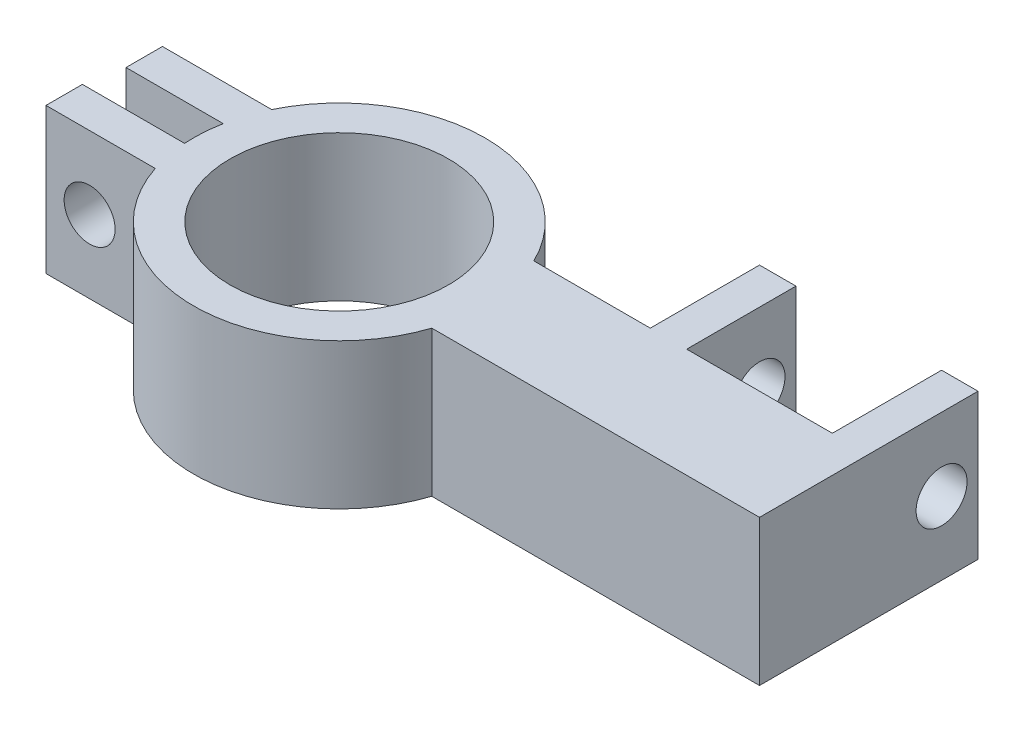
ISO-10303-21;
HEADER;
FILE_DESCRIPTION(('STEP AP214'),'2;1');
FILE_NAME('part.step','',(''),(''),'','','');
FILE_SCHEMA(('AUTOMOTIVE_DESIGN { 1 0 10303 214 1 1 1 1 }'));
ENDSEC;
DATA;
#1=APPLICATION_CONTEXT('core data for automotive mechanical design processes');
#2=APPLICATION_PROTOCOL_DEFINITION('international standard','automotive_design',2000,#1);
#3=PRODUCT_CONTEXT('',#1,'mechanical');
#4=PRODUCT('Part','Part','',(#3));
#5=PRODUCT_RELATED_PRODUCT_CATEGORY('part','',(#4));
#6=PRODUCT_DEFINITION_FORMATION('','',#4);
#7=PRODUCT_DEFINITION_CONTEXT('part definition',#1,'design');
#8=PRODUCT_DEFINITION('design','',#6,#7);
#9=PRODUCT_DEFINITION_SHAPE('','',#8);
#10=(LENGTH_UNIT() NAMED_UNIT(*) SI_UNIT(.MILLI.,.METRE.));
#11=(NAMED_UNIT(*) PLANE_ANGLE_UNIT() SI_UNIT($,.RADIAN.));
#12=(NAMED_UNIT(*) SI_UNIT($,.STERADIAN.) SOLID_ANGLE_UNIT());
#13=UNCERTAINTY_MEASURE_WITH_UNIT(LENGTH_MEASURE(1.E-05),#10,'distance_accuracy_value','');
#14=(GEOMETRIC_REPRESENTATION_CONTEXT(3) GLOBAL_UNCERTAINTY_ASSIGNED_CONTEXT((#13)) GLOBAL_UNIT_ASSIGNED_CONTEXT((#10,
#11,#12)) REPRESENTATION_CONTEXT('',''));
#15=CARTESIAN_POINT('',(0.,0.,0.));
#16=DIRECTION('',(0.,0.,1.));
#17=DIRECTION('',(1.,0.,0.));
#18=AXIS2_PLACEMENT_3D('',#15,#16,#17);
#19=CARTESIAN_POINT('',(-30.,-20.,-30.));
#20=DIRECTION('',(-1.,0.,0.));
#21=DIRECTION('',(0.,0.,1.));
#22=AXIS2_PLACEMENT_3D('',#19,#20,#21);
#23=PLANE('',#22);
#24=CARTESIAN_POINT('',(-30.,-10.,-25.));
#25=DIRECTION('',(-1.,0.,0.));
#26=DIRECTION('',(0.,0.,1.));
#27=AXIS2_PLACEMENT_3D('',#24,#25,#26);
#28=CIRCLE('',#27,3.5);
#29=CARTESIAN_POINT('',(-30.,-10.,-21.5));
#30=VERTEX_POINT('',#29);
#31=EDGE_CURVE('E411',#30,#30,#28,.T.);
#32=ORIENTED_EDGE('',*,*,#31,.F.);
#33=EDGE_LOOP('',(#32));
#34=FACE_BOUND('',#33,.T.);
#35=DIRECTION('',(0.,0.,1.));
#36=VECTOR('',#35,1.);
#37=CARTESIAN_POINT('',(-30.,0.,-30.));
#38=LINE('',#37,#36);
#39=CARTESIAN_POINT('',(-30.,0.,-30.));
#40=VERTEX_POINT('',#39);
#41=CARTESIAN_POINT('',(-30.,0.,-15.));
#42=VERTEX_POINT('',#41);
#43=EDGE_CURVE('E270',#40,#42,#38,.T.);
#44=ORIENTED_EDGE('',*,*,#43,.F.);
#45=DIRECTION('',(0.,1.,0.));
#46=VECTOR('',#45,1.);
#47=CARTESIAN_POINT('',(-30.,-20.,-30.));
#48=LINE('',#47,#46);
#49=CARTESIAN_POINT('',(-30.,-20.,-30.));
#50=VERTEX_POINT('',#49);
#51=EDGE_CURVE('E12',#50,#40,#48,.T.);
#52=ORIENTED_EDGE('',*,*,#51,.F.);
#53=DIRECTION('',(0.,0.,1.));
#54=VECTOR('',#53,1.);
#55=CARTESIAN_POINT('',(-30.,-20.,-30.));
#56=LINE('',#55,#54);
#57=CARTESIAN_POINT('',(-30.,-20.,-15.));
#58=VERTEX_POINT('',#57);
#59=EDGE_CURVE('E337',#50,#58,#56,.T.);
#60=ORIENTED_EDGE('',*,*,#59,.T.);
#61=DIRECTION('',(0.,1.,0.));
#62=VECTOR('',#61,1.);
#63=CARTESIAN_POINT('',(-30.,-20.,-15.));
#64=LINE('',#63,#62);
#65=EDGE_CURVE('E193',#58,#42,#64,.T.);
#66=ORIENTED_EDGE('',*,*,#65,.T.);
#67=EDGE_LOOP('',(#44,#52,#60,#66));
#68=FACE_BOUND('',#67,.T.);
#69=ADVANCED_FACE('F106',(#34,#68),#23,.T.);
#70=CARTESIAN_POINT('',(-25.,-20.,-30.));
#71=DIRECTION('',(0.,0.,-1.));
#72=DIRECTION('',(-1.,0.,0.));
#73=AXIS2_PLACEMENT_3D('',#70,#71,#72);
#74=PLANE('',#73);
#75=DIRECTION('',(-1.,0.,0.));
#76=VECTOR('',#75,1.);
#77=CARTESIAN_POINT('',(-25.,0.,-30.));
#78=LINE('',#77,#76);
#79=CARTESIAN_POINT('',(-25.,0.,-30.));
#80=VERTEX_POINT('',#79);
#81=EDGE_CURVE('E334',#80,#40,#78,.T.);
#82=ORIENTED_EDGE('',*,*,#81,.F.);
#83=DIRECTION('',(0.,1.,0.));
#84=VECTOR('',#83,1.);
#85=CARTESIAN_POINT('',(-25.,-20.,-30.));
#86=LINE('',#85,#84);
#87=CARTESIAN_POINT('',(-25.,-20.,-30.));
#88=VERTEX_POINT('',#87);
#89=EDGE_CURVE('E116',#88,#80,#86,.T.);
#90=ORIENTED_EDGE('',*,*,#89,.F.);
#91=DIRECTION('',(-1.,0.,0.));
#92=VECTOR('',#91,1.);
#93=CARTESIAN_POINT('',(-25.,-20.,-30.));
#94=LINE('',#93,#92);
#95=EDGE_CURVE('E256',#88,#50,#94,.T.);
#96=ORIENTED_EDGE('',*,*,#95,.T.);
#97=ORIENTED_EDGE('',*,*,#51,.T.);
#98=EDGE_LOOP('',(#82,#90,#96,#97));
#99=FACE_BOUND('',#98,.T.);
#100=ADVANCED_FACE('F524',(#99),#74,.T.);
#101=CARTESIAN_POINT('',(-25.,-20.,-15.));
#102=DIRECTION('',(1.,0.,0.));
#103=DIRECTION('',(0.,0.,-1.));
#104=AXIS2_PLACEMENT_3D('',#101,#102,#103);
#105=PLANE('',#104);
#106=CARTESIAN_POINT('',(-25.,-10.,-25.));
#107=DIRECTION('',(1.,0.,0.));
#108=DIRECTION('',(0.,0.,-1.));
#109=AXIS2_PLACEMENT_3D('',#106,#107,#108);
#110=CIRCLE('',#109,3.5);
#111=CARTESIAN_POINT('',(-25.,-10.,-28.5));
#112=VERTEX_POINT('',#111);
#113=EDGE_CURVE('E395',#112,#112,#110,.T.);
#114=ORIENTED_EDGE('',*,*,#113,.F.);
#115=EDGE_LOOP('',(#114));
#116=FACE_BOUND('',#115,.T.);
#117=DIRECTION('',(0.,0.,-1.));
#118=VECTOR('',#117,1.);
#119=CARTESIAN_POINT('',(-25.,0.,-15.));
#120=LINE('',#119,#118);
#121=CARTESIAN_POINT('',(-25.,0.,-15.));
#122=VERTEX_POINT('',#121);
#123=EDGE_CURVE('E242',#122,#80,#120,.T.);
#124=ORIENTED_EDGE('',*,*,#123,.F.);
#125=DIRECTION('',(0.,1.,0.));
#126=VECTOR('',#125,1.);
#127=CARTESIAN_POINT('',(-25.,-20.,-15.));
#128=LINE('',#127,#126);
#129=CARTESIAN_POINT('',(-25.,-20.,-15.));
#130=VERTEX_POINT('',#129);
#131=EDGE_CURVE('E237',#130,#122,#128,.T.);
#132=ORIENTED_EDGE('',*,*,#131,.F.);
#133=DIRECTION('',(0.,0.,-1.));
#134=VECTOR('',#133,1.);
#135=CARTESIAN_POINT('',(-25.,-20.,-15.));
#136=LINE('',#135,#134);
#137=EDGE_CURVE('E240',#130,#88,#136,.T.);
#138=ORIENTED_EDGE('',*,*,#137,.T.);
#139=ORIENTED_EDGE('',*,*,#89,.T.);
#140=EDGE_LOOP('',(#124,#132,#138,#139));
#141=FACE_BOUND('',#140,.T.);
#142=ADVANCED_FACE('F239',(#116,#141),#105,.T.);
#143=CARTESIAN_POINT('',(-5.,-20.,-15.));
#144=DIRECTION('',(0.,0.,-1.));
#145=DIRECTION('',(-1.,0.,0.));
#146=AXIS2_PLACEMENT_3D('',#143,#144,#145);
#147=PLANE('',#146);
#148=DIRECTION('',(-1.,0.,0.));
#149=VECTOR('',#148,1.);
#150=CARTESIAN_POINT('',(-5.,0.,-15.));
#151=LINE('',#150,#149);
#152=CARTESIAN_POINT('',(-5.,0.,-15.));
#153=VERTEX_POINT('',#152);
#154=EDGE_CURVE('E329',#153,#122,#151,.T.);
#155=ORIENTED_EDGE('',*,*,#154,.F.);
#156=DIRECTION('',(0.,1.,0.));
#157=VECTOR('',#156,1.);
#158=CARTESIAN_POINT('',(-5.,-20.,-15.));
#159=LINE('',#158,#157);
#160=CARTESIAN_POINT('',(-5.,-20.,-15.));
#161=VERTEX_POINT('',#160);
#162=EDGE_CURVE('E248',#161,#153,#159,.T.);
#163=ORIENTED_EDGE('',*,*,#162,.F.);
#164=DIRECTION('',(-1.,0.,0.));
#165=VECTOR('',#164,1.);
#166=CARTESIAN_POINT('',(-5.,-20.,-15.));
#167=LINE('',#166,#165);
#168=EDGE_CURVE('E254',#161,#130,#167,.T.);
#169=ORIENTED_EDGE('',*,*,#168,.T.);
#170=ORIENTED_EDGE('',*,*,#131,.T.);
#171=EDGE_LOOP('',(#155,#163,#169,#170));
#172=FACE_BOUND('',#171,.T.);
#173=ADVANCED_FACE('F259',(#172),#147,.T.);
#174=CARTESIAN_POINT('',(-5.,-20.,-30.));
#175=DIRECTION('',(-1.,0.,0.));
#176=DIRECTION('',(0.,0.,1.));
#177=AXIS2_PLACEMENT_3D('',#174,#175,#176);
#178=PLANE('',#177);
#179=CARTESIAN_POINT('',(-5.,-10.,-25.));
#180=DIRECTION('',(-1.,0.,0.));
#181=DIRECTION('',(0.,0.,1.));
#182=AXIS2_PLACEMENT_3D('',#179,#180,#181);
#183=CIRCLE('',#182,3.5);
#184=CARTESIAN_POINT('',(-5.,-10.,-21.5));
#185=VERTEX_POINT('',#184);
#186=EDGE_CURVE('E388',#185,#185,#183,.T.);
#187=ORIENTED_EDGE('',*,*,#186,.F.);
#188=EDGE_LOOP('',(#187));
#189=FACE_BOUND('',#188,.T.);
#190=DIRECTION('',(0.,0.,1.));
#191=VECTOR('',#190,1.);
#192=CARTESIAN_POINT('',(-5.,0.,-30.));
#193=LINE('',#192,#191);
#194=CARTESIAN_POINT('',(-5.,0.,-30.));
#195=VERTEX_POINT('',#194);
#196=EDGE_CURVE('E325',#195,#153,#193,.T.);
#197=ORIENTED_EDGE('',*,*,#196,.F.);
#198=DIRECTION('',(0.,1.,0.));
#199=VECTOR('',#198,1.);
#200=CARTESIAN_POINT('',(-5.,-20.,-30.));
#201=LINE('',#200,#199);
#202=CARTESIAN_POINT('',(-5.,-20.,-30.));
#203=VERTEX_POINT('',#202);
#204=EDGE_CURVE('E343',#203,#195,#201,.T.);
#205=ORIENTED_EDGE('',*,*,#204,.F.);
#206=DIRECTION('',(0.,0.,1.));
#207=VECTOR('',#206,1.);
#208=CARTESIAN_POINT('',(-5.,-20.,-30.));
#209=LINE('',#208,#207);
#210=EDGE_CURVE('E261',#203,#161,#209,.T.);
#211=ORIENTED_EDGE('',*,*,#210,.T.);
#212=ORIENTED_EDGE('',*,*,#162,.T.);
#213=EDGE_LOOP('',(#197,#205,#211,#212));
#214=FACE_BOUND('',#213,.T.);
#215=ADVANCED_FACE('F539',(#189,#214),#178,.T.);
#216=CARTESIAN_POINT('',(0.,-20.,-30.));
#217=DIRECTION('',(0.,0.,-1.));
#218=DIRECTION('',(-1.,0.,0.));
#219=AXIS2_PLACEMENT_3D('',#216,#217,#218);
#220=PLANE('',#219);
#221=DIRECTION('',(-1.,0.,0.));
#222=VECTOR('',#221,1.);
#223=CARTESIAN_POINT('',(0.,0.,-30.));
#224=LINE('',#223,#222);
#225=CARTESIAN_POINT('',(0.,0.,-30.));
#226=VERTEX_POINT('',#225);
#227=EDGE_CURVE('E321',#226,#195,#224,.T.);
#228=ORIENTED_EDGE('',*,*,#227,.F.);
#229=DIRECTION('',(0.,1.,0.));
#230=VECTOR('',#229,1.);
#231=CARTESIAN_POINT('',(0.,-20.,-30.));
#232=LINE('',#231,#230);
#233=CARTESIAN_POINT('',(0.,-20.,-30.));
#234=VERTEX_POINT('',#233);
#235=EDGE_CURVE('E346',#234,#226,#232,.T.);
#236=ORIENTED_EDGE('',*,*,#235,.F.);
#237=DIRECTION('',(-1.,0.,0.));
#238=VECTOR('',#237,1.);
#239=CARTESIAN_POINT('',(0.,-20.,-30.));
#240=LINE('',#239,#238);
#241=EDGE_CURVE('E264',#234,#203,#240,.T.);
#242=ORIENTED_EDGE('',*,*,#241,.T.);
#243=ORIENTED_EDGE('',*,*,#204,.T.);
#244=EDGE_LOOP('',(#228,#236,#242,#243));
#245=FACE_BOUND('',#244,.T.);
#246=ADVANCED_FACE('F471',(#245),#220,.T.);
#247=CARTESIAN_POINT('',(0.,-20.,0.));
#248=DIRECTION('',(1.,0.,0.));
#249=DIRECTION('',(0.,0.,-1.));
#250=AXIS2_PLACEMENT_3D('',#247,#248,#249);
#251=PLANE('',#250);
#252=CARTESIAN_POINT('',(0.,-10.,-25.));
#253=DIRECTION('',(1.,0.,0.));
#254=DIRECTION('',(0.,0.,-1.));
#255=AXIS2_PLACEMENT_3D('',#252,#253,#254);
#256=CIRCLE('',#255,3.5);
#257=CARTESIAN_POINT('',(0.,-10.,-28.5));
#258=VERTEX_POINT('',#257);
#259=EDGE_CURVE('E385',#258,#258,#256,.T.);
#260=ORIENTED_EDGE('',*,*,#259,.F.);
#261=EDGE_LOOP('',(#260));
#262=FACE_BOUND('',#261,.T.);
#263=DIRECTION('',(0.,0.,-1.));
#264=VECTOR('',#263,1.);
#265=CARTESIAN_POINT('',(0.,0.,0.));
#266=LINE('',#265,#264);
#267=CARTESIAN_POINT('',(0.,0.,0.));
#268=VERTEX_POINT('',#267);
#269=EDGE_CURVE('E317',#268,#226,#266,.T.);
#270=ORIENTED_EDGE('',*,*,#269,.F.);
#271=DIRECTION('',(0.,1.,0.));
#272=VECTOR('',#271,1.);
#273=CARTESIAN_POINT('',(0.,-20.,0.));
#274=LINE('',#273,#272);
#275=CARTESIAN_POINT('',(0.,-20.,0.));
#276=VERTEX_POINT('',#275);
#277=EDGE_CURVE('E349',#276,#268,#274,.T.);
#278=ORIENTED_EDGE('',*,*,#277,.F.);
#279=DIRECTION('',(0.,0.,-1.));
#280=VECTOR('',#279,1.);
#281=CARTESIAN_POINT('',(0.,-20.,0.));
#282=LINE('',#281,#280);
#283=EDGE_CURVE('E463',#276,#234,#282,.T.);
#284=ORIENTED_EDGE('',*,*,#283,.T.);
#285=ORIENTED_EDGE('',*,*,#235,.T.);
#286=EDGE_LOOP('',(#270,#278,#284,#285));
#287=FACE_BOUND('',#286,.T.);
#288=ADVANCED_FACE('F476',(#262,#287),#251,.T.);
#289=CARTESIAN_POINT('',(0.,-20.,0.));
#290=DIRECTION('',(0.,0.,-1.));
#291=DIRECTION('',(-1.,0.,0.));
#292=AXIS2_PLACEMENT_3D('',#289,#290,#291);
#293=PLANE('',#292);
#294=DIRECTION('',(-1.,0.,0.));
#295=VECTOR('',#294,1.);
#296=CARTESIAN_POINT('',(0.,0.,0.));
#297=LINE('',#296,#295);
#298=CARTESIAN_POINT('',(-45.,0.,0.));
#299=VERTEX_POINT('',#298);
#300=EDGE_CURVE('E313',#268,#299,#297,.T.);
#301=ORIENTED_EDGE('',*,*,#300,.T.);
#302=DIRECTION('',(0.,1.,0.));
#303=VECTOR('',#302,1.);
#304=CARTESIAN_POINT('',(-45.,-20.,0.));
#305=LINE('',#304,#303);
#306=CARTESIAN_POINT('',(-45.,-20.,0.));
#307=VERTEX_POINT('',#306);
#308=EDGE_CURVE('E352',#307,#299,#305,.T.);
#309=ORIENTED_EDGE('',*,*,#308,.F.);
#310=DIRECTION('',(-1.,0.,0.));
#311=VECTOR('',#310,1.);
#312=CARTESIAN_POINT('',(0.,-20.,0.));
#313=LINE('',#312,#311);
#314=EDGE_CURVE('E460',#276,#307,#313,.T.);
#315=ORIENTED_EDGE('',*,*,#314,.F.);
#316=ORIENTED_EDGE('',*,*,#277,.T.);
#317=EDGE_LOOP('',(#301,#309,#315,#316));
#318=FACE_BOUND('',#317,.T.);
#319=ADVANCED_FACE('F481',(#318),#293,.F.);
#320=CARTESIAN_POINT('',(-63.9877312128764,-20.,-6.28220211291865));
#321=DIRECTION('',(0.,1.,0.));
#322=DIRECTION('',(0.,0.,1.));
#323=AXIS2_PLACEMENT_3D('',#320,#321,#322);
#324=CYLINDRICAL_SURFACE('',#323,20.);
#325=CARTESIAN_POINT('',(-63.9877312128764,0.,-6.28220211291865));
#326=DIRECTION('',(0.,1.,0.));
#327=DIRECTION('',(0.,0.,1.));
#328=AXIS2_PLACEMENT_3D('',#325,#326,#327);
#329=CIRCLE('',#328,20.);
#330=CARTESIAN_POINT('',(-82.9754624257528,0.,0.));
#331=VERTEX_POINT('',#330);
#332=EDGE_CURVE('E309',#331,#299,#329,.T.);
#333=ORIENTED_EDGE('',*,*,#332,.F.);
#334=DIRECTION('',(0.,1.,0.));
#335=VECTOR('',#334,1.);
#336=CARTESIAN_POINT('',(-82.9754624257528,-20.,0.));
#337=LINE('',#336,#335);
#338=CARTESIAN_POINT('',(-82.9754624257528,-20.,0.));
#339=VERTEX_POINT('',#338);
#340=EDGE_CURVE('E355',#339,#331,#337,.T.);
#341=ORIENTED_EDGE('',*,*,#340,.F.);
#342=CARTESIAN_POINT('',(-63.9877312128764,-20.,-6.28220211291865));
#343=DIRECTION('',(0.,1.,0.));
#344=DIRECTION('',(0.,0.,1.));
#345=AXIS2_PLACEMENT_3D('',#342,#343,#344);
#346=CIRCLE('',#345,20.);
#347=EDGE_CURVE('E456',#339,#307,#346,.T.);
#348=ORIENTED_EDGE('',*,*,#347,.T.);
#349=ORIENTED_EDGE('',*,*,#308,.T.);
#350=EDGE_LOOP('',(#333,#341,#348,#349));
#351=FACE_BOUND('',#350,.T.);
#352=ADVANCED_FACE('F487',(#351),#324,.T.);
#353=CARTESIAN_POINT('',(-82.9754624257528,-20.,0.));
#354=DIRECTION('',(0.,0.,-1.));
#355=DIRECTION('',(-1.,0.,0.));
#356=AXIS2_PLACEMENT_3D('',#353,#354,#355);
#357=PLANE('',#356);
#358=CARTESIAN_POINT('',(-91.9877312128764,-10.,0.));
#359=DIRECTION('',(0.,0.,-1.));
#360=DIRECTION('',(-1.,0.,0.));
#361=AXIS2_PLACEMENT_3D('',#358,#359,#360);
#362=CIRCLE('',#361,3.50000000000001);
#363=CARTESIAN_POINT('',(-95.4877312128764,-10.,0.));
#364=VERTEX_POINT('',#363);
#365=EDGE_CURVE('E389',#364,#364,#362,.T.);
#366=ORIENTED_EDGE('',*,*,#365,.T.);
#367=EDGE_LOOP('',(#366));
#368=FACE_BOUND('',#367,.T.);
#369=DIRECTION('',(-1.,0.,0.));
#370=VECTOR('',#369,1.);
#371=CARTESIAN_POINT('',(-82.9754624257528,0.,0.));
#372=LINE('',#371,#370);
#373=CARTESIAN_POINT('',(-97.9754624257528,0.,0.));
#374=VERTEX_POINT('',#373);
#375=EDGE_CURVE('E306',#331,#374,#372,.T.);
#376=ORIENTED_EDGE('',*,*,#375,.T.);
#377=DIRECTION('',(0.,1.,0.));
#378=VECTOR('',#377,1.);
#379=CARTESIAN_POINT('',(-97.9754624257528,-20.,0.));
#380=LINE('',#379,#378);
#381=CARTESIAN_POINT('',(-97.9754624257528,-20.,0.));
#382=VERTEX_POINT('',#381);
#383=EDGE_CURVE('E358',#382,#374,#380,.T.);
#384=ORIENTED_EDGE('',*,*,#383,.F.);
#385=DIRECTION('',(-1.,0.,0.));
#386=VECTOR('',#385,1.);
#387=CARTESIAN_POINT('',(-82.9754624257528,-20.,0.));
#388=LINE('',#387,#386);
#389=EDGE_CURVE('E453',#339,#382,#388,.T.);
#390=ORIENTED_EDGE('',*,*,#389,.F.);
#391=ORIENTED_EDGE('',*,*,#340,.T.);
#392=EDGE_LOOP('',(#376,#384,#390,#391));
#393=FACE_BOUND('',#392,.T.);
#394=ADVANCED_FACE('F490',(#368,#393),#357,.F.);
#395=CARTESIAN_POINT('',(-97.9754624257528,-20.,0.));
#396=DIRECTION('',(1.,0.,0.));
#397=DIRECTION('',(0.,0.,-1.));
#398=AXIS2_PLACEMENT_3D('',#395,#396,#397);
#399=PLANE('',#398);
#400=DIRECTION('',(0.,0.,-1.));
#401=VECTOR('',#400,1.);
#402=CARTESIAN_POINT('',(-97.9754624257528,0.,0.));
#403=LINE('',#402,#401);
#404=CARTESIAN_POINT('',(-97.9754624257528,0.,-5.));
#405=VERTEX_POINT('',#404);
#406=EDGE_CURVE('E303',#374,#405,#403,.T.);
#407=ORIENTED_EDGE('',*,*,#406,.T.);
#408=DIRECTION('',(0.,1.,0.));
#409=VECTOR('',#408,1.);
#410=CARTESIAN_POINT('',(-97.9754624257528,-20.,-5.));
#411=LINE('',#410,#409);
#412=CARTESIAN_POINT('',(-97.9754624257528,-20.,-5.));
#413=VERTEX_POINT('',#412);
#414=EDGE_CURVE('E362',#413,#405,#411,.T.);
#415=ORIENTED_EDGE('',*,*,#414,.F.);
#416=DIRECTION('',(0.,0.,-1.));
#417=VECTOR('',#416,1.);
#418=CARTESIAN_POINT('',(-97.9754624257528,-20.,0.));
#419=LINE('',#418,#417);
#420=EDGE_CURVE('E450',#382,#413,#419,.T.);
#421=ORIENTED_EDGE('',*,*,#420,.F.);
#422=ORIENTED_EDGE('',*,*,#383,.T.);
#423=EDGE_LOOP('',(#407,#415,#421,#422));
#424=FACE_BOUND('',#423,.T.);
#425=ADVANCED_FACE('F495',(#424),#399,.F.);
#426=CARTESIAN_POINT('',(-97.9754624257528,-20.,-5.));
#427=DIRECTION('',(0.,0.,1.));
#428=DIRECTION('',(1.,0.,0.));
#429=AXIS2_PLACEMENT_3D('',#426,#427,#428);
#430=PLANE('',#429);
#431=CARTESIAN_POINT('',(-91.9877312128764,-10.,-5.));
#432=DIRECTION('',(0.,0.,1.));
#433=DIRECTION('',(1.,0.,0.));
#434=AXIS2_PLACEMENT_3D('',#431,#432,#433);
#435=CIRCLE('',#434,3.50000000000001);
#436=CARTESIAN_POINT('',(-88.4877312128764,-10.,-5.));
#437=VERTEX_POINT('',#436);
#438=EDGE_CURVE('E398',#437,#437,#435,.T.);
#439=ORIENTED_EDGE('',*,*,#438,.T.);
#440=EDGE_LOOP('',(#439));
#441=FACE_BOUND('',#440,.T.);
#442=DIRECTION('',(1.,0.,0.));
#443=VECTOR('',#442,1.);
#444=CARTESIAN_POINT('',(-97.9754624257528,0.,-5.));
#445=LINE('',#444,#443);
#446=CARTESIAN_POINT('',(-83.9465878369826,0.,-5.00000000000001));
#447=VERTEX_POINT('',#446);
#448=EDGE_CURVE('E299',#405,#447,#445,.T.);
#449=ORIENTED_EDGE('',*,*,#448,.T.);
#450=DIRECTION('',(0.,1.,0.));
#451=VECTOR('',#450,1.);
#452=CARTESIAN_POINT('',(-83.9465878369826,-20.,-5.00000000000001));
#453=LINE('',#452,#451);
#454=CARTESIAN_POINT('',(-83.9465878369826,-20.,-5.00000000000001));
#455=VERTEX_POINT('',#454);
#456=EDGE_CURVE('E366',#455,#447,#453,.T.);
#457=ORIENTED_EDGE('',*,*,#456,.F.);
#458=DIRECTION('',(1.,0.,0.));
#459=VECTOR('',#458,1.);
#460=CARTESIAN_POINT('',(-97.9754624257528,-20.,-5.));
#461=LINE('',#460,#459);
#462=EDGE_CURVE('E447',#413,#455,#461,.T.);
#463=ORIENTED_EDGE('',*,*,#462,.F.);
#464=ORIENTED_EDGE('',*,*,#414,.T.);
#465=EDGE_LOOP('',(#449,#457,#463,#464));
#466=FACE_BOUND('',#465,.T.);
#467=ADVANCED_FACE('F501',(#441,#466),#430,.F.);
#468=CARTESIAN_POINT('',(-63.9877312128764,-20.,-6.28220211291865));
#469=DIRECTION('',(0.,1.,0.));
#470=DIRECTION('',(0.,0.,1.));
#471=AXIS2_PLACEMENT_3D('',#468,#469,#470);
#472=CYLINDRICAL_SURFACE('',#471,20.);
#473=CARTESIAN_POINT('',(-63.9877312128764,0.,-6.28220211291865));
#474=DIRECTION('',(0.,1.,0.));
#475=DIRECTION('',(0.,0.,1.));
#476=AXIS2_PLACEMENT_3D('',#473,#474,#475);
#477=CIRCLE('',#476,20.);
#478=CARTESIAN_POINT('',(-83.639142838274,0.,-9.99999999999999));
#479=VERTEX_POINT('',#478);
#480=EDGE_CURVE('E295',#479,#447,#477,.T.);
#481=ORIENTED_EDGE('',*,*,#480,.F.);
#482=DIRECTION('',(0.,1.,0.));
#483=VECTOR('',#482,1.);
#484=CARTESIAN_POINT('',(-83.639142838274,-20.,-9.99999999999999));
#485=LINE('',#484,#483);
#486=CARTESIAN_POINT('',(-83.639142838274,-20.,-9.99999999999999));
#487=VERTEX_POINT('',#486);
#488=EDGE_CURVE('E369',#487,#479,#485,.T.);
#489=ORIENTED_EDGE('',*,*,#488,.F.);
#490=CARTESIAN_POINT('',(-63.9877312128764,-20.,-6.28220211291865));
#491=DIRECTION('',(0.,1.,0.));
#492=DIRECTION('',(0.,0.,1.));
#493=AXIS2_PLACEMENT_3D('',#490,#491,#492);
#494=CIRCLE('',#493,20.);
#495=EDGE_CURVE('E443',#487,#455,#494,.T.);
#496=ORIENTED_EDGE('',*,*,#495,.T.);
#497=ORIENTED_EDGE('',*,*,#456,.T.);
#498=EDGE_LOOP('',(#481,#489,#496,#497));
#499=FACE_BOUND('',#498,.T.);
#500=ADVANCED_FACE('F505',(#499),#472,.T.);
#501=CARTESIAN_POINT('',(-96.9877312128764,-20.,-9.99999999999999));
#502=DIRECTION('',(0.,0.,1.));
#503=DIRECTION('',(1.,0.,0.));
#504=AXIS2_PLACEMENT_3D('',#501,#502,#503);
#505=PLANE('',#504);
#506=CARTESIAN_POINT('',(-91.9877312128764,-10.,-9.99999999999999));
#507=DIRECTION('',(0.,0.,1.));
#508=DIRECTION('',(1.,0.,0.));
#509=AXIS2_PLACEMENT_3D('',#506,#507,#508);
#510=CIRCLE('',#509,3.50000000000001);
#511=CARTESIAN_POINT('',(-88.4877312128764,-10.,-9.99999999999999));
#512=VERTEX_POINT('',#511);
#513=EDGE_CURVE('E404',#512,#512,#510,.T.);
#514=ORIENTED_EDGE('',*,*,#513,.F.);
#515=EDGE_LOOP('',(#514));
#516=FACE_BOUND('',#515,.T.);
#517=DIRECTION('',(1.,0.,0.));
#518=VECTOR('',#517,1.);
#519=CARTESIAN_POINT('',(-96.9877312128764,0.,-9.99999999999999));
#520=LINE('',#519,#518);
#521=CARTESIAN_POINT('',(-96.9877312128764,0.,-9.99999999999999));
#522=VERTEX_POINT('',#521);
#523=EDGE_CURVE('E291',#522,#479,#520,.T.);
#524=ORIENTED_EDGE('',*,*,#523,.F.);
#525=DIRECTION('',(0.,1.,0.));
#526=VECTOR('',#525,1.);
#527=CARTESIAN_POINT('',(-96.9877312128764,-20.,-9.99999999999999));
#528=LINE('',#527,#526);
#529=CARTESIAN_POINT('',(-96.9877312128764,-20.,-9.99999999999999));
#530=VERTEX_POINT('',#529);
#531=EDGE_CURVE('E372',#530,#522,#528,.T.);
#532=ORIENTED_EDGE('',*,*,#531,.F.);
#533=DIRECTION('',(1.,0.,0.));
#534=VECTOR('',#533,1.);
#535=CARTESIAN_POINT('',(-96.9877312128764,-20.,-9.99999999999999));
#536=LINE('',#535,#534);
#537=EDGE_CURVE('E439',#530,#487,#536,.T.);
#538=ORIENTED_EDGE('',*,*,#537,.T.);
#539=ORIENTED_EDGE('',*,*,#488,.T.);
#540=EDGE_LOOP('',(#524,#532,#538,#539));
#541=FACE_BOUND('',#540,.T.);
#542=ADVANCED_FACE('F508',(#516,#541),#505,.T.);
#543=CARTESIAN_POINT('',(-96.9877312128764,-20.,-15.));
#544=DIRECTION('',(-1.,0.,0.));
#545=DIRECTION('',(0.,0.,1.));
#546=AXIS2_PLACEMENT_3D('',#543,#544,#545);
#547=PLANE('',#546);
#548=DIRECTION('',(0.,0.,1.));
#549=VECTOR('',#548,1.);
#550=CARTESIAN_POINT('',(-96.9877312128764,0.,-15.));
#551=LINE('',#550,#549);
#552=CARTESIAN_POINT('',(-96.9877312128764,0.,-15.));
#553=VERTEX_POINT('',#552);
#554=EDGE_CURVE('E287',#553,#522,#551,.T.);
#555=ORIENTED_EDGE('',*,*,#554,.F.);
#556=DIRECTION('',(0.,1.,0.));
#557=VECTOR('',#556,1.);
#558=CARTESIAN_POINT('',(-96.9877312128764,-20.,-15.));
#559=LINE('',#558,#557);
#560=CARTESIAN_POINT('',(-96.9877312128764,-20.,-15.));
#561=VERTEX_POINT('',#560);
#562=EDGE_CURVE('E375',#561,#553,#559,.T.);
#563=ORIENTED_EDGE('',*,*,#562,.F.);
#564=DIRECTION('',(0.,0.,1.));
#565=VECTOR('',#564,1.);
#566=CARTESIAN_POINT('',(-96.9877312128764,-20.,-15.));
#567=LINE('',#566,#565);
#568=EDGE_CURVE('E435',#561,#530,#567,.T.);
#569=ORIENTED_EDGE('',*,*,#568,.T.);
#570=ORIENTED_EDGE('',*,*,#531,.T.);
#571=EDGE_LOOP('',(#555,#563,#569,#570));
#572=FACE_BOUND('',#571,.T.);
#573=ADVANCED_FACE('F513',(#572),#547,.T.);
#574=CARTESIAN_POINT('',(-81.9877312128764,-20.,-15.));
#575=DIRECTION('',(0.,0.,-1.));
#576=DIRECTION('',(-1.,0.,0.));
#577=AXIS2_PLACEMENT_3D('',#574,#575,#576);
#578=PLANE('',#577);
#579=CARTESIAN_POINT('',(-91.9877312128764,-10.,-15.));
#580=DIRECTION('',(0.,0.,-1.));
#581=DIRECTION('',(-1.,0.,0.));
#582=AXIS2_PLACEMENT_3D('',#579,#580,#581);
#583=CIRCLE('',#582,3.50000000000001);
#584=CARTESIAN_POINT('',(-95.4877312128764,-10.,-15.));
#585=VERTEX_POINT('',#584);
#586=EDGE_CURVE('E109',#585,#585,#583,.T.);
#587=ORIENTED_EDGE('',*,*,#586,.F.);
#588=EDGE_LOOP('',(#587));
#589=FACE_BOUND('',#588,.T.);
#590=DIRECTION('',(-1.,0.,0.));
#591=VECTOR('',#590,1.);
#592=CARTESIAN_POINT('',(-81.9877312128764,0.,-15.));
#593=LINE('',#592,#591);
#594=CARTESIAN_POINT('',(-81.9877312128764,0.,-15.));
#595=VERTEX_POINT('',#594);
#596=EDGE_CURVE('E283',#595,#553,#593,.T.);
#597=ORIENTED_EDGE('',*,*,#596,.F.);
#598=DIRECTION('',(0.,1.,0.));
#599=VECTOR('',#598,1.);
#600=CARTESIAN_POINT('',(-81.9877312128764,-20.,-15.));
#601=LINE('',#600,#599);
#602=CARTESIAN_POINT('',(-81.9877312128764,-20.,-15.));
#603=VERTEX_POINT('',#602);
#604=EDGE_CURVE('E378',#603,#595,#601,.T.);
#605=ORIENTED_EDGE('',*,*,#604,.F.);
#606=DIRECTION('',(-1.,0.,0.));
#607=VECTOR('',#606,1.);
#608=CARTESIAN_POINT('',(-81.9877312128764,-20.,-15.));
#609=LINE('',#608,#607);
#610=EDGE_CURVE('E431',#603,#561,#609,.T.);
#611=ORIENTED_EDGE('',*,*,#610,.T.);
#612=ORIENTED_EDGE('',*,*,#562,.T.);
#613=EDGE_LOOP('',(#597,#605,#611,#612));
#614=FACE_BOUND('',#613,.T.);
#615=ADVANCED_FACE('F516',(#589,#614),#578,.T.);
#616=CARTESIAN_POINT('',(-63.9877312128764,-20.,-6.28220211291865));
#617=DIRECTION('',(0.,1.,0.));
#618=DIRECTION('',(0.,0.,1.));
#619=AXIS2_PLACEMENT_3D('',#616,#617,#618);
#620=CYLINDRICAL_SURFACE('',#619,20.);
#621=CARTESIAN_POINT('',(-63.9877312128764,0.,-6.28220211291865));
#622=DIRECTION('',(0.,1.,0.));
#623=DIRECTION('',(0.,0.,1.));
#624=AXIS2_PLACEMENT_3D('',#621,#622,#623);
#625=CIRCLE('',#624,20.);
#626=CARTESIAN_POINT('',(-45.9877312128764,0.,-15.));
#627=VERTEX_POINT('',#626);
#628=EDGE_CURVE('E279',#627,#595,#625,.T.);
#629=ORIENTED_EDGE('',*,*,#628,.F.);
#630=DIRECTION('',(0.,1.,0.));
#631=VECTOR('',#630,1.);
#632=CARTESIAN_POINT('',(-45.9877312128764,-20.,-15.));
#633=LINE('',#632,#631);
#634=CARTESIAN_POINT('',(-45.9877312128764,-20.,-15.));
#635=VERTEX_POINT('',#634);
#636=EDGE_CURVE('E381',#635,#627,#633,.T.);
#637=ORIENTED_EDGE('',*,*,#636,.F.);
#638=CARTESIAN_POINT('',(-63.9877312128764,-20.,-6.28220211291865));
#639=DIRECTION('',(0.,1.,0.));
#640=DIRECTION('',(0.,0.,1.));
#641=AXIS2_PLACEMENT_3D('',#638,#639,#640);
#642=CIRCLE('',#641,20.);
#643=EDGE_CURVE('E427',#635,#603,#642,.T.);
#644=ORIENTED_EDGE('',*,*,#643,.T.);
#645=ORIENTED_EDGE('',*,*,#604,.T.);
#646=EDGE_LOOP('',(#629,#637,#644,#645));
#647=FACE_BOUND('',#646,.T.);
#648=ADVANCED_FACE('F520',(#647),#620,.T.);
#649=CARTESIAN_POINT('',(-30.,-20.,-15.));
#650=DIRECTION('',(0.,0.,-1.));
#651=DIRECTION('',(-1.,0.,0.));
#652=AXIS2_PLACEMENT_3D('',#649,#650,#651);
#653=PLANE('',#652);
#654=DIRECTION('',(-1.,0.,0.));
#655=VECTOR('',#654,1.);
#656=CARTESIAN_POINT('',(-30.,0.,-15.));
#657=LINE('',#656,#655);
#658=EDGE_CURVE('E274',#42,#627,#657,.T.);
#659=ORIENTED_EDGE('',*,*,#658,.F.);
#660=ORIENTED_EDGE('',*,*,#65,.F.);
#661=DIRECTION('',(-1.,0.,0.));
#662=VECTOR('',#661,1.);
#663=CARTESIAN_POINT('',(-30.,-20.,-15.));
#664=LINE('',#663,#662);
#665=EDGE_CURVE('E424',#58,#635,#664,.T.);
#666=ORIENTED_EDGE('',*,*,#665,.T.);
#667=ORIENTED_EDGE('',*,*,#636,.T.);
#668=EDGE_LOOP('',(#659,#660,#666,#667));
#669=FACE_BOUND('',#668,.T.);
#670=ADVANCED_FACE('F521',(#669),#653,.T.);
#671=CARTESIAN_POINT('',(-63.9877312128764,-20.,-6.28220211291865));
#672=DIRECTION('',(0.,1.,0.));
#673=DIRECTION('',(0.,0.,1.));
#674=AXIS2_PLACEMENT_3D('',#671,#672,#673);
#675=PLANE('',#674);
#676=CARTESIAN_POINT('',(-63.9877312128764,-20.,-6.28220211291865));
#677=DIRECTION('',(0.,1.,0.));
#678=DIRECTION('',(0.,0.,1.));
#679=AXIS2_PLACEMENT_3D('',#676,#677,#678);
#680=CIRCLE('',#679,15.);
#681=CARTESIAN_POINT('',(-63.9877312128764,-20.,8.71779788708135));
#682=VERTEX_POINT('',#681);
#683=EDGE_CURVE('E275',#682,#682,#680,.T.);
#684=ORIENTED_EDGE('',*,*,#683,.T.);
#685=EDGE_LOOP('',(#684));
#686=FACE_BOUND('',#685,.T.);
#687=ORIENTED_EDGE('',*,*,#59,.F.);
#688=ORIENTED_EDGE('',*,*,#95,.F.);
#689=ORIENTED_EDGE('',*,*,#137,.F.);
#690=ORIENTED_EDGE('',*,*,#168,.F.);
#691=ORIENTED_EDGE('',*,*,#210,.F.);
#692=ORIENTED_EDGE('',*,*,#241,.F.);
#693=ORIENTED_EDGE('',*,*,#283,.F.);
#694=ORIENTED_EDGE('',*,*,#314,.T.);
#695=ORIENTED_EDGE('',*,*,#347,.F.);
#696=ORIENTED_EDGE('',*,*,#389,.T.);
#697=ORIENTED_EDGE('',*,*,#420,.T.);
#698=ORIENTED_EDGE('',*,*,#462,.T.);
#699=ORIENTED_EDGE('',*,*,#495,.F.);
#700=ORIENTED_EDGE('',*,*,#537,.F.);
#701=ORIENTED_EDGE('',*,*,#568,.F.);
#702=ORIENTED_EDGE('',*,*,#610,.F.);
#703=ORIENTED_EDGE('',*,*,#643,.F.);
#704=ORIENTED_EDGE('',*,*,#665,.F.);
#705=EDGE_LOOP('',(#687,#688,#689,#690,#691,#692,#693,#694,#695,#696,#697,#698,#699,#700,#701,
#702,#703,#704));
#706=FACE_BOUND('',#705,.T.);
#707=ADVANCED_FACE('F252',(#686,#706),#675,.F.);
#708=CARTESIAN_POINT('',(-63.9877312128764,0.,-6.28220211291865));
#709=DIRECTION('',(0.,1.,0.));
#710=DIRECTION('',(0.,0.,1.));
#711=AXIS2_PLACEMENT_3D('',#708,#709,#710);
#712=PLANE('',#711);
#713=CARTESIAN_POINT('',(-63.9877312128764,0.,-6.28220211291865));
#714=DIRECTION('',(0.,1.,0.));
#715=DIRECTION('',(0.,0.,1.));
#716=AXIS2_PLACEMENT_3D('',#713,#714,#715);
#717=CIRCLE('',#716,15.);
#718=CARTESIAN_POINT('',(-63.9877312128764,0.,8.71779788708135));
#719=VERTEX_POINT('',#718);
#720=EDGE_CURVE('E415',#719,#719,#717,.T.);
#721=ORIENTED_EDGE('',*,*,#720,.F.);
#722=EDGE_LOOP('',(#721));
#723=FACE_BOUND('',#722,.T.);
#724=ORIENTED_EDGE('',*,*,#43,.T.);
#725=ORIENTED_EDGE('',*,*,#658,.T.);
#726=ORIENTED_EDGE('',*,*,#628,.T.);
#727=ORIENTED_EDGE('',*,*,#596,.T.);
#728=ORIENTED_EDGE('',*,*,#554,.T.);
#729=ORIENTED_EDGE('',*,*,#523,.T.);
#730=ORIENTED_EDGE('',*,*,#480,.T.);
#731=ORIENTED_EDGE('',*,*,#448,.F.);
#732=ORIENTED_EDGE('',*,*,#406,.F.);
#733=ORIENTED_EDGE('',*,*,#375,.F.);
#734=ORIENTED_EDGE('',*,*,#332,.T.);
#735=ORIENTED_EDGE('',*,*,#300,.F.);
#736=ORIENTED_EDGE('',*,*,#269,.T.);
#737=ORIENTED_EDGE('',*,*,#227,.T.);
#738=ORIENTED_EDGE('',*,*,#196,.T.);
#739=ORIENTED_EDGE('',*,*,#154,.T.);
#740=ORIENTED_EDGE('',*,*,#123,.T.);
#741=ORIENTED_EDGE('',*,*,#81,.T.);
#742=EDGE_LOOP('',(#724,#725,#726,#727,#728,#729,#730,#731,#732,#733,#734,#735,#736,#737,#738,
#739,#740,#741));
#743=FACE_BOUND('',#742,.T.);
#744=ADVANCED_FACE('F523',(#723,#743),#712,.T.);
#745=CARTESIAN_POINT('',(-63.9877312128764,-20.,-6.28220211291865));
#746=DIRECTION('',(0.,1.,0.));
#747=DIRECTION('',(0.,0.,1.));
#748=AXIS2_PLACEMENT_3D('',#745,#746,#747);
#749=CYLINDRICAL_SURFACE('',#748,15.);
#750=ORIENTED_EDGE('',*,*,#683,.F.);
#751=EDGE_LOOP('',(#750));
#752=FACE_BOUND('',#751,.T.);
#753=ORIENTED_EDGE('',*,*,#720,.T.);
#754=EDGE_LOOP('',(#753));
#755=FACE_BOUND('',#754,.T.);
#756=ADVANCED_FACE('F578',(#752,#755),#749,.F.);
#757=CARTESIAN_POINT('',(-36.5,-10.,-25.));
#758=DIRECTION('',(1.,0.,0.));
#759=DIRECTION('',(0.,0.,-1.));
#760=AXIS2_PLACEMENT_3D('',#757,#758,#759);
#761=CYLINDRICAL_SURFACE('',#760,3.5);
#762=ORIENTED_EDGE('',*,*,#186,.T.);
#763=EDGE_LOOP('',(#762));
#764=FACE_BOUND('',#763,.T.);
#765=ORIENTED_EDGE('',*,*,#259,.T.);
#766=EDGE_LOOP('',(#765));
#767=FACE_BOUND('',#766,.T.);
#768=ADVANCED_FACE('F583',(#764,#767),#761,.F.);
#769=ORIENTED_EDGE('',*,*,#31,.T.);
#770=EDGE_LOOP('',(#769));
#771=FACE_BOUND('',#770,.T.);
#772=ORIENTED_EDGE('',*,*,#113,.T.);
#773=EDGE_LOOP('',(#772));
#774=FACE_BOUND('',#773,.T.);
#775=ADVANCED_FACE('F587',(#771,#774),#761,.F.);
#776=CARTESIAN_POINT('',(-91.9877312128764,-10.,21.5));
#777=DIRECTION('',(0.,0.,-1.));
#778=DIRECTION('',(-1.,0.,0.));
#779=AXIS2_PLACEMENT_3D('',#776,#777,#778);
#780=CYLINDRICAL_SURFACE('',#779,3.50000000000001);
#781=ORIENTED_EDGE('',*,*,#513,.T.);
#782=EDGE_LOOP('',(#781));
#783=FACE_BOUND('',#782,.T.);
#784=ORIENTED_EDGE('',*,*,#586,.T.);
#785=EDGE_LOOP('',(#784));
#786=FACE_BOUND('',#785,.T.);
#787=ADVANCED_FACE('F589',(#783,#786),#780,.F.);
#788=ORIENTED_EDGE('',*,*,#438,.F.);
#789=EDGE_LOOP('',(#788));
#790=FACE_BOUND('',#789,.T.);
#791=ORIENTED_EDGE('',*,*,#365,.F.);
#792=EDGE_LOOP('',(#791));
#793=FACE_BOUND('',#792,.T.);
#794=ADVANCED_FACE('F591',(#790,#793),#780,.F.);
#795=CLOSED_SHELL('',(#69,#100,#142,#173,#215,#246,#288,#319,#352,#394,#425,#467,#500,#542,#573,
#615,#648,#670,#707,#744,#756,#768,#775,#787,#794));
#796=MANIFOLD_SOLID_BREP('B2',#795);
#797=ADVANCED_BREP_SHAPE_REPRESENTATION('',(#18,#796),#14);
#798=SHAPE_DEFINITION_REPRESENTATION(#9,#797);
ENDSEC;
END-ISO-10303-21;
